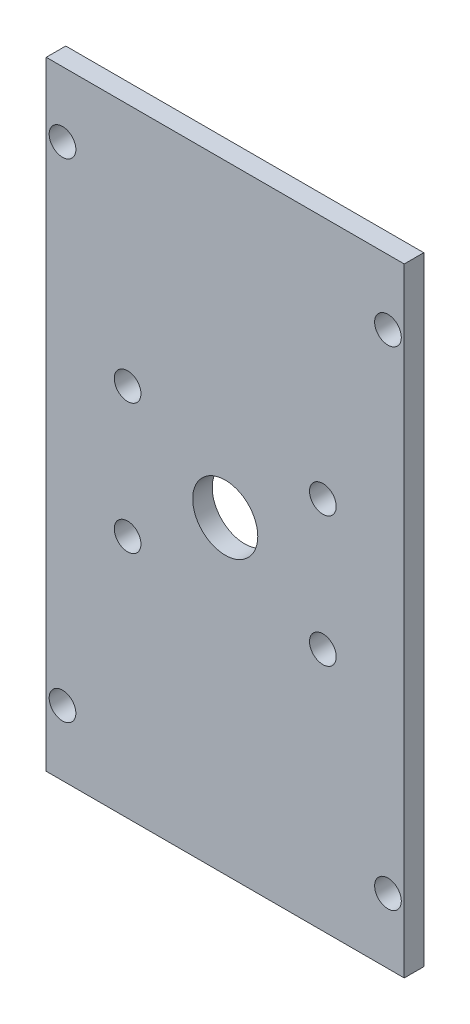
ISO-10303-21;
HEADER;
FILE_DESCRIPTION(('STEP AP214'),'2;1');
FILE_NAME('part.step','',(''),(''),'','','');
FILE_SCHEMA(('AUTOMOTIVE_DESIGN { 1 0 10303 214 1 1 1 1 }'));
ENDSEC;
DATA;
#1=APPLICATION_CONTEXT('core data for automotive mechanical design processes');
#2=APPLICATION_PROTOCOL_DEFINITION('international standard','automotive_design',2000,#1);
#3=PRODUCT_CONTEXT('',#1,'mechanical');
#4=PRODUCT('Part','Part','',(#3));
#5=PRODUCT_RELATED_PRODUCT_CATEGORY('part','',(#4));
#6=PRODUCT_DEFINITION_FORMATION('','',#4);
#7=PRODUCT_DEFINITION_CONTEXT('part definition',#1,'design');
#8=PRODUCT_DEFINITION('design','',#6,#7);
#9=PRODUCT_DEFINITION_SHAPE('','',#8);
#10=(LENGTH_UNIT() NAMED_UNIT(*) SI_UNIT(.MILLI.,.METRE.));
#11=(NAMED_UNIT(*) PLANE_ANGLE_UNIT() SI_UNIT($,.RADIAN.));
#12=(NAMED_UNIT(*) SI_UNIT($,.STERADIAN.) SOLID_ANGLE_UNIT());
#13=UNCERTAINTY_MEASURE_WITH_UNIT(LENGTH_MEASURE(1.E-05),#10,'distance_accuracy_value','');
#14=(GEOMETRIC_REPRESENTATION_CONTEXT(3) GLOBAL_UNCERTAINTY_ASSIGNED_CONTEXT((#13)) GLOBAL_UNIT_ASSIGNED_CONTEXT((#10,
#11,#12)) REPRESENTATION_CONTEXT('',''));
#15=CARTESIAN_POINT('',(0.,0.,0.));
#16=DIRECTION('',(0.,0.,1.));
#17=DIRECTION('',(1.,0.,0.));
#18=AXIS2_PLACEMENT_3D('',#15,#16,#17);
#19=CARTESIAN_POINT('',(55.,95.,6.));
#20=DIRECTION('',(-1.,0.,0.));
#21=DIRECTION('',(0.,-1.,0.));
#22=AXIS2_PLACEMENT_3D('',#19,#20,#21);
#23=PLANE('',#22);
#24=DIRECTION('',(0.,1.,0.));
#25=VECTOR('',#24,1.);
#26=CARTESIAN_POINT('',(55.,95.,0.));
#27=LINE('',#26,#25);
#28=CARTESIAN_POINT('',(55.,-95.,0.));
#29=VERTEX_POINT('',#28);
#30=CARTESIAN_POINT('',(55.,95.,0.));
#31=VERTEX_POINT('',#30);
#32=EDGE_CURVE('E107',#29,#31,#27,.T.);
#33=ORIENTED_EDGE('',*,*,#32,.T.);
#34=DIRECTION('',(0.,0.,-1.));
#35=VECTOR('',#34,1.);
#36=CARTESIAN_POINT('',(55.,95.,6.));
#37=LINE('',#36,#35);
#38=CARTESIAN_POINT('',(55.,95.,6.));
#39=VERTEX_POINT('',#38);
#40=EDGE_CURVE('E11',#39,#31,#37,.T.);
#41=ORIENTED_EDGE('',*,*,#40,.F.);
#42=DIRECTION('',(0.,1.,0.));
#43=VECTOR('',#42,1.);
#44=CARTESIAN_POINT('',(55.,95.,6.));
#45=LINE('',#44,#43);
#46=CARTESIAN_POINT('',(55.,-95.,6.));
#47=VERTEX_POINT('',#46);
#48=EDGE_CURVE('E88',#47,#39,#45,.T.);
#49=ORIENTED_EDGE('',*,*,#48,.F.);
#50=DIRECTION('',(0.,0.,-1.));
#51=VECTOR('',#50,1.);
#52=CARTESIAN_POINT('',(55.,-95.,6.));
#53=LINE('',#52,#51);
#54=EDGE_CURVE('E103',#47,#29,#53,.T.);
#55=ORIENTED_EDGE('',*,*,#54,.T.);
#56=EDGE_LOOP('',(#33,#41,#49,#55));
#57=FACE_BOUND('',#56,.T.);
#58=ADVANCED_FACE('F35',(#57),#23,.F.);
#59=CARTESIAN_POINT('',(-55.,95.,6.));
#60=DIRECTION('',(0.,-1.,0.));
#61=DIRECTION('',(0.,0.,-1.));
#62=AXIS2_PLACEMENT_3D('',#59,#60,#61);
#63=PLANE('',#62);
#64=DIRECTION('',(-1.,0.,0.));
#65=VECTOR('',#64,1.);
#66=CARTESIAN_POINT('',(-55.,95.,0.));
#67=LINE('',#66,#65);
#68=CARTESIAN_POINT('',(-55.,95.,0.));
#69=VERTEX_POINT('',#68);
#70=EDGE_CURVE('E93',#31,#69,#67,.T.);
#71=ORIENTED_EDGE('',*,*,#70,.T.);
#72=DIRECTION('',(0.,0.,-1.));
#73=VECTOR('',#72,1.);
#74=CARTESIAN_POINT('',(-55.,95.,6.));
#75=LINE('',#74,#73);
#76=CARTESIAN_POINT('',(-55.,95.,6.));
#77=VERTEX_POINT('',#76);
#78=EDGE_CURVE('E44',#77,#69,#75,.T.);
#79=ORIENTED_EDGE('',*,*,#78,.F.);
#80=DIRECTION('',(-1.,0.,0.));
#81=VECTOR('',#80,1.);
#82=CARTESIAN_POINT('',(-55.,95.,6.));
#83=LINE('',#82,#81);
#84=EDGE_CURVE('E83',#39,#77,#83,.T.);
#85=ORIENTED_EDGE('',*,*,#84,.F.);
#86=ORIENTED_EDGE('',*,*,#40,.T.);
#87=EDGE_LOOP('',(#71,#79,#85,#86));
#88=FACE_BOUND('',#87,.T.);
#89=ADVANCED_FACE('F92',(#88),#63,.F.);
#90=CARTESIAN_POINT('',(-55.,95.,6.));
#91=DIRECTION('',(1.,0.,0.));
#92=DIRECTION('',(0.,1.,0.));
#93=AXIS2_PLACEMENT_3D('',#90,#91,#92);
#94=PLANE('',#93);
#95=DIRECTION('',(0.,-1.,0.));
#96=VECTOR('',#95,1.);
#97=CARTESIAN_POINT('',(-55.,95.,0.));
#98=LINE('',#97,#96);
#99=CARTESIAN_POINT('',(-55.,-95.,0.));
#100=VERTEX_POINT('',#99);
#101=EDGE_CURVE('E70',#69,#100,#98,.T.);
#102=ORIENTED_EDGE('',*,*,#101,.T.);
#103=DIRECTION('',(0.,0.,-1.));
#104=VECTOR('',#103,1.);
#105=CARTESIAN_POINT('',(-55.,-95.,6.));
#106=LINE('',#105,#104);
#107=CARTESIAN_POINT('',(-55.,-95.,6.));
#108=VERTEX_POINT('',#107);
#109=EDGE_CURVE('E94',#108,#100,#106,.T.);
#110=ORIENTED_EDGE('',*,*,#109,.F.);
#111=DIRECTION('',(0.,-1.,0.));
#112=VECTOR('',#111,1.);
#113=CARTESIAN_POINT('',(-55.,95.,6.));
#114=LINE('',#113,#112);
#115=EDGE_CURVE('E86',#77,#108,#114,.T.);
#116=ORIENTED_EDGE('',*,*,#115,.F.);
#117=ORIENTED_EDGE('',*,*,#78,.T.);
#118=EDGE_LOOP('',(#102,#110,#116,#117));
#119=FACE_BOUND('',#118,.T.);
#120=ADVANCED_FACE('F96',(#119),#94,.F.);
#121=CARTESIAN_POINT('',(-55.,-95.,6.));
#122=DIRECTION('',(0.,1.,0.));
#123=DIRECTION('',(0.,0.,1.));
#124=AXIS2_PLACEMENT_3D('',#121,#122,#123);
#125=PLANE('',#124);
#126=DIRECTION('',(1.,0.,0.));
#127=VECTOR('',#126,1.);
#128=CARTESIAN_POINT('',(-55.,-95.,0.));
#129=LINE('',#128,#127);
#130=EDGE_CURVE('E76',#100,#29,#129,.T.);
#131=ORIENTED_EDGE('',*,*,#130,.T.);
#132=ORIENTED_EDGE('',*,*,#54,.F.);
#133=DIRECTION('',(1.,0.,0.));
#134=VECTOR('',#133,1.);
#135=CARTESIAN_POINT('',(-55.,-95.,6.));
#136=LINE('',#135,#134);
#137=EDGE_CURVE('E53',#108,#47,#136,.T.);
#138=ORIENTED_EDGE('',*,*,#137,.F.);
#139=ORIENTED_EDGE('',*,*,#109,.T.);
#140=EDGE_LOOP('',(#131,#132,#138,#139));
#141=FACE_BOUND('',#140,.T.);
#142=ADVANCED_FACE('F218',(#141),#125,.F.);
#143=CARTESIAN_POINT('',(0.,0.,6.));
#144=DIRECTION('',(0.,0.,1.));
#145=DIRECTION('',(1.,0.,0.));
#146=AXIS2_PLACEMENT_3D('',#143,#144,#145);
#147=PLANE('',#146);
#148=CARTESIAN_POINT('',(-30.,20.,6.));
#149=DIRECTION('',(0.,0.,1.));
#150=DIRECTION('',(1.,0.,0.));
#151=AXIS2_PLACEMENT_3D('',#148,#149,#150);
#152=CIRCLE('',#151,4.09999999999999);
#153=CARTESIAN_POINT('',(-25.9,20.,6.));
#154=VERTEX_POINT('',#153);
#155=EDGE_CURVE('E356',#154,#154,#152,.T.);
#156=ORIENTED_EDGE('',*,*,#155,.F.);
#157=EDGE_LOOP('',(#156));
#158=FACE_BOUND('',#157,.T.);
#159=CARTESIAN_POINT('',(30.,20.,6.));
#160=DIRECTION('',(0.,0.,1.));
#161=DIRECTION('',(1.,0.,0.));
#162=AXIS2_PLACEMENT_3D('',#159,#160,#161);
#163=CIRCLE('',#162,4.09999999999999);
#164=CARTESIAN_POINT('',(34.1,20.,6.));
#165=VERTEX_POINT('',#164);
#166=EDGE_CURVE('E145',#165,#165,#163,.T.);
#167=ORIENTED_EDGE('',*,*,#166,.F.);
#168=EDGE_LOOP('',(#167));
#169=FACE_BOUND('',#168,.T.);
#170=CARTESIAN_POINT('',(30.,-20.,6.));
#171=DIRECTION('',(0.,0.,1.));
#172=DIRECTION('',(1.,0.,0.));
#173=AXIS2_PLACEMENT_3D('',#170,#171,#172);
#174=CIRCLE('',#173,4.09999999999999);
#175=CARTESIAN_POINT('',(34.1,-20.,6.));
#176=VERTEX_POINT('',#175);
#177=EDGE_CURVE('E128',#176,#176,#174,.T.);
#178=ORIENTED_EDGE('',*,*,#177,.F.);
#179=EDGE_LOOP('',(#178));
#180=FACE_BOUND('',#179,.T.);
#181=CARTESIAN_POINT('',(-30.,-20.,6.));
#182=DIRECTION('',(0.,0.,1.));
#183=DIRECTION('',(1.,0.,0.));
#184=AXIS2_PLACEMENT_3D('',#181,#182,#183);
#185=CIRCLE('',#184,4.09999999999999);
#186=CARTESIAN_POINT('',(-25.9,-20.,6.));
#187=VERTEX_POINT('',#186);
#188=EDGE_CURVE('E124',#187,#187,#185,.T.);
#189=ORIENTED_EDGE('',*,*,#188,.F.);
#190=EDGE_LOOP('',(#189));
#191=FACE_BOUND('',#190,.T.);
#192=CARTESIAN_POINT('',(0.,0.,6.));
#193=DIRECTION('',(0.,0.,1.));
#194=DIRECTION('',(1.,0.,0.));
#195=AXIS2_PLACEMENT_3D('',#192,#193,#194);
#196=CIRCLE('',#195,10.);
#197=CARTESIAN_POINT('',(10.,0.,6.));
#198=VERTEX_POINT('',#197);
#199=EDGE_CURVE('E123',#198,#198,#196,.T.);
#200=ORIENTED_EDGE('',*,*,#199,.F.);
#201=EDGE_LOOP('',(#200));
#202=FACE_BOUND('',#201,.T.);
#203=CARTESIAN_POINT('',(-50.,75.,6.));
#204=DIRECTION('',(0.,0.,1.));
#205=DIRECTION('',(1.,0.,0.));
#206=AXIS2_PLACEMENT_3D('',#203,#204,#205);
#207=CIRCLE('',#206,4.09999999999999);
#208=CARTESIAN_POINT('',(-45.9,75.,6.));
#209=VERTEX_POINT('',#208);
#210=EDGE_CURVE('E156',#209,#209,#207,.T.);
#211=ORIENTED_EDGE('',*,*,#210,.F.);
#212=EDGE_LOOP('',(#211));
#213=FACE_BOUND('',#212,.T.);
#214=CARTESIAN_POINT('',(50.,75.,6.));
#215=DIRECTION('',(0.,0.,1.));
#216=DIRECTION('',(1.,0.,0.));
#217=AXIS2_PLACEMENT_3D('',#214,#215,#216);
#218=CIRCLE('',#217,4.09999999999999);
#219=CARTESIAN_POINT('',(54.1,75.,6.));
#220=VERTEX_POINT('',#219);
#221=EDGE_CURVE('E164',#220,#220,#218,.T.);
#222=ORIENTED_EDGE('',*,*,#221,.F.);
#223=EDGE_LOOP('',(#222));
#224=FACE_BOUND('',#223,.T.);
#225=CARTESIAN_POINT('',(50.,-75.,6.));
#226=DIRECTION('',(0.,0.,1.));
#227=DIRECTION('',(1.,0.,0.));
#228=AXIS2_PLACEMENT_3D('',#225,#226,#227);
#229=CIRCLE('',#228,4.09999999999999);
#230=CARTESIAN_POINT('',(54.1,-75.,6.));
#231=VERTEX_POINT('',#230);
#232=EDGE_CURVE('E172',#231,#231,#229,.T.);
#233=ORIENTED_EDGE('',*,*,#232,.F.);
#234=EDGE_LOOP('',(#233));
#235=FACE_BOUND('',#234,.T.);
#236=CARTESIAN_POINT('',(-50.,-75.,6.));
#237=DIRECTION('',(0.,0.,1.));
#238=DIRECTION('',(1.,0.,0.));
#239=AXIS2_PLACEMENT_3D('',#236,#237,#238);
#240=CIRCLE('',#239,4.09999999999999);
#241=CARTESIAN_POINT('',(-45.9,-75.,6.));
#242=VERTEX_POINT('',#241);
#243=EDGE_CURVE('E179',#242,#242,#240,.T.);
#244=ORIENTED_EDGE('',*,*,#243,.F.);
#245=EDGE_LOOP('',(#244));
#246=FACE_BOUND('',#245,.T.);
#247=ORIENTED_EDGE('',*,*,#48,.T.);
#248=ORIENTED_EDGE('',*,*,#84,.T.);
#249=ORIENTED_EDGE('',*,*,#115,.T.);
#250=ORIENTED_EDGE('',*,*,#137,.T.);
#251=EDGE_LOOP('',(#247,#248,#249,#250));
#252=FACE_BOUND('',#251,.T.);
#253=ADVANCED_FACE('F84',(#158,#169,#180,#191,#202,#213,#224,#235,#246,#252),#147,.T.);
#254=CARTESIAN_POINT('',(0.,0.,0.));
#255=DIRECTION('',(0.,0.,1.));
#256=DIRECTION('',(1.,0.,0.));
#257=AXIS2_PLACEMENT_3D('',#254,#255,#256);
#258=PLANE('',#257);
#259=CARTESIAN_POINT('',(-30.,20.,0.));
#260=DIRECTION('',(0.,0.,1.));
#261=DIRECTION('',(1.,0.,0.));
#262=AXIS2_PLACEMENT_3D('',#259,#260,#261);
#263=CIRCLE('',#262,4.09999999999999);
#264=CARTESIAN_POINT('',(-25.9,20.,0.));
#265=VERTEX_POINT('',#264);
#266=EDGE_CURVE('E353',#265,#265,#263,.T.);
#267=ORIENTED_EDGE('',*,*,#266,.T.);
#268=EDGE_LOOP('',(#267));
#269=FACE_BOUND('',#268,.T.);
#270=CARTESIAN_POINT('',(30.,20.,0.));
#271=DIRECTION('',(0.,0.,1.));
#272=DIRECTION('',(1.,0.,0.));
#273=AXIS2_PLACEMENT_3D('',#270,#271,#272);
#274=CIRCLE('',#273,4.09999999999999);
#275=CARTESIAN_POINT('',(34.1,20.,0.));
#276=VERTEX_POINT('',#275);
#277=EDGE_CURVE('E38',#276,#276,#274,.T.);
#278=ORIENTED_EDGE('',*,*,#277,.T.);
#279=EDGE_LOOP('',(#278));
#280=FACE_BOUND('',#279,.T.);
#281=CARTESIAN_POINT('',(30.,-20.,0.));
#282=DIRECTION('',(0.,0.,1.));
#283=DIRECTION('',(1.,0.,0.));
#284=AXIS2_PLACEMENT_3D('',#281,#282,#283);
#285=CIRCLE('',#284,4.09999999999999);
#286=CARTESIAN_POINT('',(34.1,-20.,0.));
#287=VERTEX_POINT('',#286);
#288=EDGE_CURVE('E125',#287,#287,#285,.T.);
#289=ORIENTED_EDGE('',*,*,#288,.T.);
#290=EDGE_LOOP('',(#289));
#291=FACE_BOUND('',#290,.T.);
#292=CARTESIAN_POINT('',(-30.,-20.,0.));
#293=DIRECTION('',(0.,0.,1.));
#294=DIRECTION('',(1.,0.,0.));
#295=AXIS2_PLACEMENT_3D('',#292,#293,#294);
#296=CIRCLE('',#295,4.09999999999999);
#297=CARTESIAN_POINT('',(-25.9,-20.,0.));
#298=VERTEX_POINT('',#297);
#299=EDGE_CURVE('E120',#298,#298,#296,.T.);
#300=ORIENTED_EDGE('',*,*,#299,.T.);
#301=EDGE_LOOP('',(#300));
#302=FACE_BOUND('',#301,.T.);
#303=CARTESIAN_POINT('',(0.,0.,0.));
#304=DIRECTION('',(0.,0.,1.));
#305=DIRECTION('',(1.,0.,0.));
#306=AXIS2_PLACEMENT_3D('',#303,#304,#305);
#307=CIRCLE('',#306,10.);
#308=CARTESIAN_POINT('',(10.,0.,0.));
#309=VERTEX_POINT('',#308);
#310=EDGE_CURVE('E152',#309,#309,#307,.F.);
#311=ORIENTED_EDGE('',*,*,#310,.F.);
#312=EDGE_LOOP('',(#311));
#313=FACE_BOUND('',#312,.T.);
#314=CARTESIAN_POINT('',(-50.,75.,0.));
#315=DIRECTION('',(0.,0.,1.));
#316=DIRECTION('',(1.,0.,0.));
#317=AXIS2_PLACEMENT_3D('',#314,#315,#316);
#318=CIRCLE('',#317,4.09999999999999);
#319=CARTESIAN_POINT('',(-45.9,75.,0.));
#320=VERTEX_POINT('',#319);
#321=EDGE_CURVE('E160',#320,#320,#318,.T.);
#322=ORIENTED_EDGE('',*,*,#321,.T.);
#323=EDGE_LOOP('',(#322));
#324=FACE_BOUND('',#323,.T.);
#325=CARTESIAN_POINT('',(50.,75.,0.));
#326=DIRECTION('',(0.,0.,1.));
#327=DIRECTION('',(1.,0.,0.));
#328=AXIS2_PLACEMENT_3D('',#325,#326,#327);
#329=CIRCLE('',#328,4.09999999999999);
#330=CARTESIAN_POINT('',(54.1,75.,0.));
#331=VERTEX_POINT('',#330);
#332=EDGE_CURVE('E168',#331,#331,#329,.T.);
#333=ORIENTED_EDGE('',*,*,#332,.T.);
#334=EDGE_LOOP('',(#333));
#335=FACE_BOUND('',#334,.T.);
#336=CARTESIAN_POINT('',(50.,-75.,0.));
#337=DIRECTION('',(0.,0.,1.));
#338=DIRECTION('',(1.,0.,0.));
#339=AXIS2_PLACEMENT_3D('',#336,#337,#338);
#340=CIRCLE('',#339,4.09999999999999);
#341=CARTESIAN_POINT('',(54.1,-75.,0.));
#342=VERTEX_POINT('',#341);
#343=EDGE_CURVE('E176',#342,#342,#340,.T.);
#344=ORIENTED_EDGE('',*,*,#343,.T.);
#345=EDGE_LOOP('',(#344));
#346=FACE_BOUND('',#345,.T.);
#347=CARTESIAN_POINT('',(-50.,-75.,0.));
#348=DIRECTION('',(0.,0.,1.));
#349=DIRECTION('',(1.,0.,0.));
#350=AXIS2_PLACEMENT_3D('',#347,#348,#349);
#351=CIRCLE('',#350,4.09999999999999);
#352=CARTESIAN_POINT('',(-45.9,-75.,0.));
#353=VERTEX_POINT('',#352);
#354=EDGE_CURVE('E111',#353,#353,#351,.T.);
#355=ORIENTED_EDGE('',*,*,#354,.T.);
#356=EDGE_LOOP('',(#355));
#357=FACE_BOUND('',#356,.T.);
#358=ORIENTED_EDGE('',*,*,#32,.F.);
#359=ORIENTED_EDGE('',*,*,#130,.F.);
#360=ORIENTED_EDGE('',*,*,#101,.F.);
#361=ORIENTED_EDGE('',*,*,#70,.F.);
#362=EDGE_LOOP('',(#358,#359,#360,#361));
#363=FACE_BOUND('',#362,.T.);
#364=ADVANCED_FACE('F188',(#269,#280,#291,#302,#313,#324,#335,#346,#357,#363),#258,.F.);
#365=CARTESIAN_POINT('',(-50.,-75.,6.));
#366=DIRECTION('',(0.,0.,1.));
#367=DIRECTION('',(1.,0.,0.));
#368=AXIS2_PLACEMENT_3D('',#365,#366,#367);
#369=CYLINDRICAL_SURFACE('',#368,4.09999999999999);
#370=ORIENTED_EDGE('',*,*,#354,.F.);
#371=EDGE_LOOP('',(#370));
#372=FACE_BOUND('',#371,.T.);
#373=ORIENTED_EDGE('',*,*,#243,.T.);
#374=EDGE_LOOP('',(#373));
#375=FACE_BOUND('',#374,.T.);
#376=ADVANCED_FACE('F192',(#372,#375),#369,.F.);
#377=CARTESIAN_POINT('',(50.,-75.,6.));
#378=DIRECTION('',(0.,0.,1.));
#379=DIRECTION('',(1.,0.,0.));
#380=AXIS2_PLACEMENT_3D('',#377,#378,#379);
#381=CYLINDRICAL_SURFACE('',#380,4.09999999999999);
#382=ORIENTED_EDGE('',*,*,#343,.F.);
#383=EDGE_LOOP('',(#382));
#384=FACE_BOUND('',#383,.T.);
#385=ORIENTED_EDGE('',*,*,#232,.T.);
#386=EDGE_LOOP('',(#385));
#387=FACE_BOUND('',#386,.T.);
#388=ADVANCED_FACE('F257',(#384,#387),#381,.F.);
#389=CARTESIAN_POINT('',(50.,75.,6.));
#390=DIRECTION('',(0.,0.,1.));
#391=DIRECTION('',(1.,0.,0.));
#392=AXIS2_PLACEMENT_3D('',#389,#390,#391);
#393=CYLINDRICAL_SURFACE('',#392,4.09999999999999);
#394=ORIENTED_EDGE('',*,*,#332,.F.);
#395=EDGE_LOOP('',(#394));
#396=FACE_BOUND('',#395,.T.);
#397=ORIENTED_EDGE('',*,*,#221,.T.);
#398=EDGE_LOOP('',(#397));
#399=FACE_BOUND('',#398,.T.);
#400=ADVANCED_FACE('F267',(#396,#399),#393,.F.);
#401=CARTESIAN_POINT('',(-50.,75.,6.));
#402=DIRECTION('',(0.,0.,1.));
#403=DIRECTION('',(1.,0.,0.));
#404=AXIS2_PLACEMENT_3D('',#401,#402,#403);
#405=CYLINDRICAL_SURFACE('',#404,4.09999999999999);
#406=ORIENTED_EDGE('',*,*,#321,.F.);
#407=EDGE_LOOP('',(#406));
#408=FACE_BOUND('',#407,.T.);
#409=ORIENTED_EDGE('',*,*,#210,.T.);
#410=EDGE_LOOP('',(#409));
#411=FACE_BOUND('',#410,.T.);
#412=ADVANCED_FACE('F277',(#408,#411),#405,.F.);
#413=CARTESIAN_POINT('',(0.,0.,-0.00100000000000013));
#414=DIRECTION('',(0.,0.,1.));
#415=DIRECTION('',(1.,0.,0.));
#416=AXIS2_PLACEMENT_3D('',#413,#414,#415);
#417=CYLINDRICAL_SURFACE('',#416,10.);
#418=CARTESIAN_POINT('',(10.,0.,6.));
#419=CARTESIAN_POINT('',(10.,0.,5.9375));
#420=CARTESIAN_POINT('',(10.,0.,5.875));
#421=CARTESIAN_POINT('',(10.,0.,5.75));
#422=CARTESIAN_POINT('',(10.,0.,5.6875));
#423=CARTESIAN_POINT('',(10.,0.,5.5625));
#424=CARTESIAN_POINT('',(10.,0.,5.5));
#425=CARTESIAN_POINT('',(10.,0.,5.375));
#426=CARTESIAN_POINT('',(10.,0.,5.3125));
#427=CARTESIAN_POINT('',(10.,0.,5.1875));
#428=CARTESIAN_POINT('',(10.,0.,5.125));
#429=CARTESIAN_POINT('',(10.,0.,5.));
#430=CARTESIAN_POINT('',(10.,0.,4.9375));
#431=CARTESIAN_POINT('',(10.,0.,4.8125));
#432=CARTESIAN_POINT('',(10.,0.,4.75));
#433=CARTESIAN_POINT('',(10.,0.,4.625));
#434=CARTESIAN_POINT('',(10.,0.,4.5625));
#435=CARTESIAN_POINT('',(10.,0.,4.4375));
#436=CARTESIAN_POINT('',(10.,0.,4.375));
#437=CARTESIAN_POINT('',(10.,0.,4.25));
#438=CARTESIAN_POINT('',(10.,0.,4.1875));
#439=CARTESIAN_POINT('',(10.,0.,4.0625));
#440=CARTESIAN_POINT('',(10.,0.,4.));
#441=CARTESIAN_POINT('',(10.,0.,3.875));
#442=CARTESIAN_POINT('',(10.,0.,3.8125));
#443=CARTESIAN_POINT('',(10.,0.,3.6875));
#444=CARTESIAN_POINT('',(10.,0.,3.625));
#445=CARTESIAN_POINT('',(10.,0.,3.5));
#446=CARTESIAN_POINT('',(10.,0.,3.4375));
#447=CARTESIAN_POINT('',(10.,0.,3.3125));
#448=CARTESIAN_POINT('',(10.,0.,3.25));
#449=CARTESIAN_POINT('',(10.,0.,3.125));
#450=CARTESIAN_POINT('',(10.,0.,3.0625));
#451=CARTESIAN_POINT('',(10.,0.,2.9375));
#452=CARTESIAN_POINT('',(10.,0.,2.875));
#453=CARTESIAN_POINT('',(10.,0.,2.75));
#454=CARTESIAN_POINT('',(10.,0.,2.6875));
#455=CARTESIAN_POINT('',(10.,0.,2.5625));
#456=CARTESIAN_POINT('',(10.,0.,2.5));
#457=CARTESIAN_POINT('',(10.,0.,2.375));
#458=CARTESIAN_POINT('',(10.,0.,2.3125));
#459=CARTESIAN_POINT('',(10.,0.,2.1875));
#460=CARTESIAN_POINT('',(10.,0.,2.125));
#461=CARTESIAN_POINT('',(10.,0.,2.));
#462=CARTESIAN_POINT('',(10.,0.,1.9375));
#463=CARTESIAN_POINT('',(10.,0.,1.8125));
#464=CARTESIAN_POINT('',(10.,0.,1.75));
#465=CARTESIAN_POINT('',(10.,0.,1.625));
#466=CARTESIAN_POINT('',(10.,0.,1.5625));
#467=CARTESIAN_POINT('',(10.,0.,1.4375));
#468=CARTESIAN_POINT('',(10.,0.,1.375));
#469=CARTESIAN_POINT('',(10.,0.,1.25));
#470=CARTESIAN_POINT('',(10.,0.,1.1875));
#471=CARTESIAN_POINT('',(10.,0.,1.0625));
#472=CARTESIAN_POINT('',(10.,0.,1.));
#473=CARTESIAN_POINT('',(10.,0.,0.875));
#474=CARTESIAN_POINT('',(10.,0.,0.8125));
#475=CARTESIAN_POINT('',(10.,0.,0.6875));
#476=CARTESIAN_POINT('',(10.,0.,0.625));
#477=CARTESIAN_POINT('',(10.,0.,0.5));
#478=CARTESIAN_POINT('',(10.,0.,0.4375));
#479=CARTESIAN_POINT('',(10.,0.,0.3125));
#480=CARTESIAN_POINT('',(10.,0.,0.25));
#481=CARTESIAN_POINT('',(10.,0.,0.125));
#482=CARTESIAN_POINT('',(10.,0.,0.0625000000000001));
#483=CARTESIAN_POINT('',(10.,0.,0.));
#484=B_SPLINE_CURVE_WITH_KNOTS('',3,(#418,#419,#420,#421,#422,#423,#424,#425,#426,#427,#428,
#429,#430,#431,#432,#433,#434,#435,#436,#437,#438,#439,#440,#441,#442,#443,#444,#445,#446,#447,
#448,#449,#450,#451,#452,#453,#454,#455,#456,#457,#458,#459,#460,#461,#462,#463,#464,#465,#466,
#467,#468,#469,#470,#471,#472,#473,#474,#475,#476,#477,#478,#479,#480,#481,#482,#483),
.UNSPECIFIED.,.F.,.F.,(4,2,2,2,2,2,2,2,2,2,2,2,2,2,2,2,2,2,2,2,2,2,2,2,2,2,2,2,2,2,2,2,4),(0.,
0.1875,0.375,0.5625,0.75,0.9375,1.125,1.3125,1.5,1.6875,1.875,2.0625,2.25,2.4375,2.625,2.8125,
3.,3.1875,3.375,3.5625,3.75,3.9375,4.125,4.3125,4.5,4.6875,4.875,5.0625,5.25,5.4375,5.625,
5.8125,6.),.UNSPECIFIED.);
#485=EDGE_CURVE('BSEAM287',#198,#309,#484,.T.);
#486=ORIENTED_EDGE('',*,*,#199,.T.);
#487=ORIENTED_EDGE('',*,*,#310,.T.);
#488=ORIENTED_EDGE('',*,*,#485,.T.);
#489=ORIENTED_EDGE('',*,*,#485,.F.);
#490=EDGE_LOOP('',(#486,#488,#487,#489));
#491=FACE_BOUND('',#490,.T.);
#492=ADVANCED_FACE('F287',(#491),#417,.F.);
#493=CARTESIAN_POINT('',(-30.,-20.,6.));
#494=DIRECTION('',(0.,0.,1.));
#495=DIRECTION('',(1.,0.,0.));
#496=AXIS2_PLACEMENT_3D('',#493,#494,#495);
#497=CYLINDRICAL_SURFACE('',#496,4.09999999999999);
#498=ORIENTED_EDGE('',*,*,#188,.T.);
#499=EDGE_LOOP('',(#498));
#500=FACE_BOUND('',#499,.T.);
#501=ORIENTED_EDGE('',*,*,#299,.F.);
#502=EDGE_LOOP('',(#501));
#503=FACE_BOUND('',#502,.T.);
#504=ADVANCED_FACE('F295',(#500,#503),#497,.F.);
#505=CARTESIAN_POINT('',(30.,-20.,6.));
#506=DIRECTION('',(0.,0.,1.));
#507=DIRECTION('',(1.,0.,0.));
#508=AXIS2_PLACEMENT_3D('',#505,#506,#507);
#509=CYLINDRICAL_SURFACE('',#508,4.09999999999999);
#510=ORIENTED_EDGE('',*,*,#177,.T.);
#511=EDGE_LOOP('',(#510));
#512=FACE_BOUND('',#511,.T.);
#513=ORIENTED_EDGE('',*,*,#288,.F.);
#514=EDGE_LOOP('',(#513));
#515=FACE_BOUND('',#514,.T.);
#516=ADVANCED_FACE('F303',(#512,#515),#509,.F.);
#517=CARTESIAN_POINT('',(30.,20.,6.));
#518=DIRECTION('',(0.,0.,1.));
#519=DIRECTION('',(1.,0.,0.));
#520=AXIS2_PLACEMENT_3D('',#517,#518,#519);
#521=CYLINDRICAL_SURFACE('',#520,4.09999999999999);
#522=ORIENTED_EDGE('',*,*,#166,.T.);
#523=EDGE_LOOP('',(#522));
#524=FACE_BOUND('',#523,.T.);
#525=ORIENTED_EDGE('',*,*,#277,.F.);
#526=EDGE_LOOP('',(#525));
#527=FACE_BOUND('',#526,.T.);
#528=ADVANCED_FACE('F313',(#524,#527),#521,.F.);
#529=CARTESIAN_POINT('',(-30.,20.,6.));
#530=DIRECTION('',(0.,0.,1.));
#531=DIRECTION('',(1.,0.,0.));
#532=AXIS2_PLACEMENT_3D('',#529,#530,#531);
#533=CYLINDRICAL_SURFACE('',#532,4.09999999999999);
#534=ORIENTED_EDGE('',*,*,#155,.T.);
#535=EDGE_LOOP('',(#534));
#536=FACE_BOUND('',#535,.T.);
#537=ORIENTED_EDGE('',*,*,#266,.F.);
#538=EDGE_LOOP('',(#537));
#539=FACE_BOUND('',#538,.T.);
#540=ADVANCED_FACE('F322',(#536,#539),#533,.F.);
#541=CLOSED_SHELL('',(#58,#89,#120,#142,#253,#364,#376,#388,#400,#412,#492,#504,#516,#528,#540));
#542=MANIFOLD_SOLID_BREP('B2',#541);
#543=ADVANCED_BREP_SHAPE_REPRESENTATION('',(#18,#542),#14);
#544=SHAPE_DEFINITION_REPRESENTATION(#9,#543);
ENDSEC;
END-ISO-10303-21;
